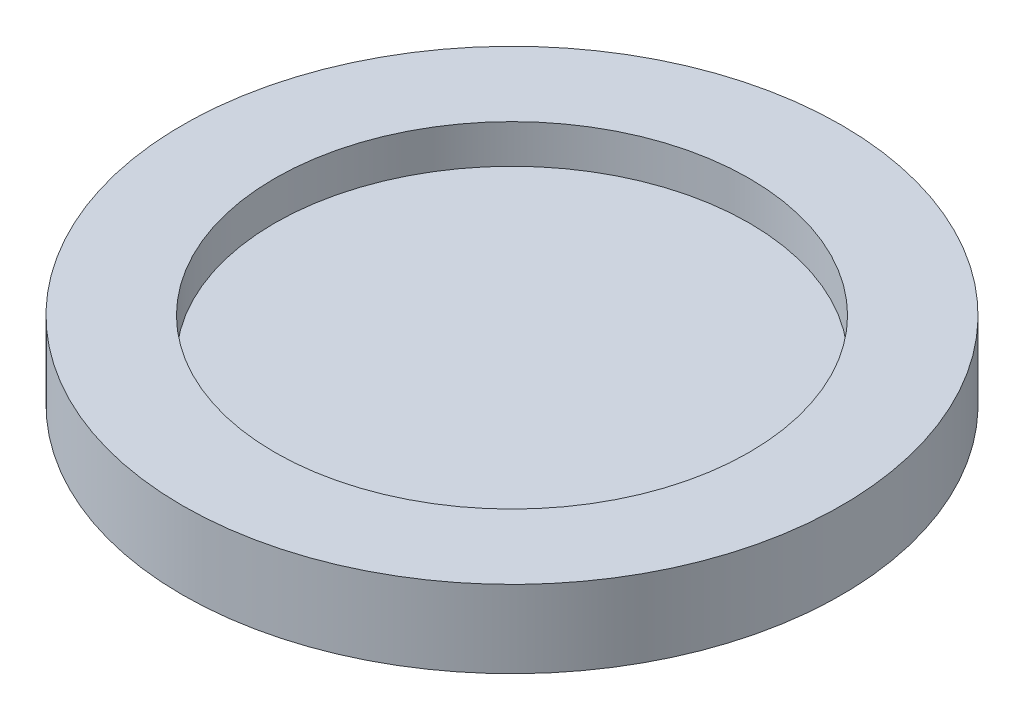
ISO-10303-21;
HEADER;
FILE_DESCRIPTION(('STEP AP214'),'2;1');
FILE_NAME('part.step','',(''),(''),'','','');
FILE_SCHEMA(('AUTOMOTIVE_DESIGN { 1 0 10303 214 1 1 1 1 }'));
ENDSEC;
DATA;
#1=APPLICATION_CONTEXT('core data for automotive mechanical design processes');
#2=APPLICATION_PROTOCOL_DEFINITION('international standard','automotive_design',2000,#1);
#3=PRODUCT_CONTEXT('',#1,'mechanical');
#4=PRODUCT('Part','Part','',(#3));
#5=PRODUCT_RELATED_PRODUCT_CATEGORY('part','',(#4));
#6=PRODUCT_DEFINITION_FORMATION('','',#4);
#7=PRODUCT_DEFINITION_CONTEXT('part definition',#1,'design');
#8=PRODUCT_DEFINITION('design','',#6,#7);
#9=PRODUCT_DEFINITION_SHAPE('','',#8);
#10=(LENGTH_UNIT() NAMED_UNIT(*) SI_UNIT(.MILLI.,.METRE.));
#11=(NAMED_UNIT(*) PLANE_ANGLE_UNIT() SI_UNIT($,.RADIAN.));
#12=(NAMED_UNIT(*) SI_UNIT($,.STERADIAN.) SOLID_ANGLE_UNIT());
#13=UNCERTAINTY_MEASURE_WITH_UNIT(LENGTH_MEASURE(1.E-05),#10,'distance_accuracy_value','');
#14=(GEOMETRIC_REPRESENTATION_CONTEXT(3) GLOBAL_UNCERTAINTY_ASSIGNED_CONTEXT((#13)) GLOBAL_UNIT_ASSIGNED_CONTEXT((#10,
#11,#12)) REPRESENTATION_CONTEXT('',''));
#15=CARTESIAN_POINT('',(0.,0.,0.));
#16=DIRECTION('',(0.,0.,1.));
#17=DIRECTION('',(1.,0.,0.));
#18=AXIS2_PLACEMENT_3D('',#15,#16,#17);
#19=CARTESIAN_POINT('',(0.,2.2,0.));
#20=DIRECTION('',(0.,-1.,0.));
#21=DIRECTION('',(0.,0.,-1.));
#22=AXIS2_PLACEMENT_3D('',#19,#20,#21);
#23=CYLINDRICAL_SURFACE('',#22,9.375);
#24=CARTESIAN_POINT('',(0.,2.2,0.));
#25=DIRECTION('',(0.,1.,0.));
#26=DIRECTION('',(0.,0.,1.));
#27=AXIS2_PLACEMENT_3D('',#24,#25,#26);
#28=CIRCLE('',#27,9.375);
#29=CARTESIAN_POINT('',(0.,2.2,9.375));
#30=VERTEX_POINT('',#29);
#31=EDGE_CURVE('E10',#30,#30,#28,.T.);
#32=ORIENTED_EDGE('',*,*,#31,.F.);
#33=EDGE_LOOP('',(#32));
#34=FACE_BOUND('',#33,.T.);
#35=CARTESIAN_POINT('',(0.,0.,0.));
#36=DIRECTION('',(0.,1.,0.));
#37=DIRECTION('',(0.,0.,1.));
#38=AXIS2_PLACEMENT_3D('',#35,#36,#37);
#39=CIRCLE('',#38,9.375);
#40=CARTESIAN_POINT('',(0.,0.,9.375));
#41=VERTEX_POINT('',#40);
#42=EDGE_CURVE('E37',#41,#41,#39,.T.);
#43=ORIENTED_EDGE('',*,*,#42,.T.);
#44=EDGE_LOOP('',(#43));
#45=FACE_BOUND('',#44,.T.);
#46=ADVANCED_FACE('F34',(#34,#45),#23,.T.);
#47=CARTESIAN_POINT('',(0.,2.2,0.));
#48=DIRECTION('',(0.,1.,0.));
#49=DIRECTION('',(0.,0.,1.));
#50=AXIS2_PLACEMENT_3D('',#47,#48,#49);
#51=PLANE('',#50);
#52=CARTESIAN_POINT('',(0.,2.2,0.));
#53=DIRECTION('',(0.,1.,0.));
#54=DIRECTION('',(0.,0.,1.));
#55=AXIS2_PLACEMENT_3D('',#52,#53,#54);
#56=CIRCLE('',#55,6.75);
#57=CARTESIAN_POINT('',(0.,2.2,6.75));
#58=VERTEX_POINT('',#57);
#59=EDGE_CURVE('E46',#58,#58,#56,.T.);
#60=ORIENTED_EDGE('',*,*,#59,.F.);
#61=EDGE_LOOP('',(#60));
#62=FACE_BOUND('',#61,.T.);
#63=ORIENTED_EDGE('',*,*,#31,.T.);
#64=EDGE_LOOP('',(#63));
#65=FACE_BOUND('',#64,.T.);
#66=ADVANCED_FACE('F61',(#62,#65),#51,.T.);
#67=CARTESIAN_POINT('',(0.,0.,0.));
#68=DIRECTION('',(0.,1.,0.));
#69=DIRECTION('',(0.,0.,1.));
#70=AXIS2_PLACEMENT_3D('',#67,#68,#69);
#71=PLANE('',#70);
#72=ORIENTED_EDGE('',*,*,#42,.F.);
#73=EDGE_LOOP('',(#72));
#74=FACE_BOUND('',#73,.T.);
#75=ADVANCED_FACE('F57',(#74),#71,.F.);
#76=CARTESIAN_POINT('',(0.,1.1,0.));
#77=DIRECTION('',(0.,1.,0.));
#78=DIRECTION('',(0.,0.,1.));
#79=AXIS2_PLACEMENT_3D('',#76,#77,#78);
#80=CYLINDRICAL_SURFACE('',#79,6.75);
#81=CARTESIAN_POINT('',(0.,1.1,0.));
#82=DIRECTION('',(0.,1.,0.));
#83=DIRECTION('',(0.,0.,1.));
#84=AXIS2_PLACEMENT_3D('',#81,#82,#83);
#85=CIRCLE('',#84,6.75);
#86=CARTESIAN_POINT('',(0.,1.1,6.75));
#87=VERTEX_POINT('',#86);
#88=EDGE_CURVE('E44',#87,#87,#85,.T.);
#89=ORIENTED_EDGE('',*,*,#88,.F.);
#90=EDGE_LOOP('',(#89));
#91=FACE_BOUND('',#90,.T.);
#92=ORIENTED_EDGE('',*,*,#59,.T.);
#93=EDGE_LOOP('',(#92));
#94=FACE_BOUND('',#93,.T.);
#95=ADVANCED_FACE('F54',(#91,#94),#80,.F.);
#96=CARTESIAN_POINT('',(0.,1.1,0.));
#97=DIRECTION('',(0.,1.,0.));
#98=DIRECTION('',(0.,0.,1.));
#99=AXIS2_PLACEMENT_3D('',#96,#97,#98);
#100=PLANE('',#99);
#101=ORIENTED_EDGE('',*,*,#88,.T.);
#102=EDGE_LOOP('',(#101));
#103=FACE_BOUND('',#102,.T.);
#104=ADVANCED_FACE('F52',(#103),#100,.T.);
#105=CLOSED_SHELL('',(#46,#66,#75,#95,#104));
#106=MANIFOLD_SOLID_BREP('B2',#105);
#107=ADVANCED_BREP_SHAPE_REPRESENTATION('',(#18,#106),#14);
#108=SHAPE_DEFINITION_REPRESENTATION(#9,#107);
ENDSEC;
END-ISO-10303-21;
